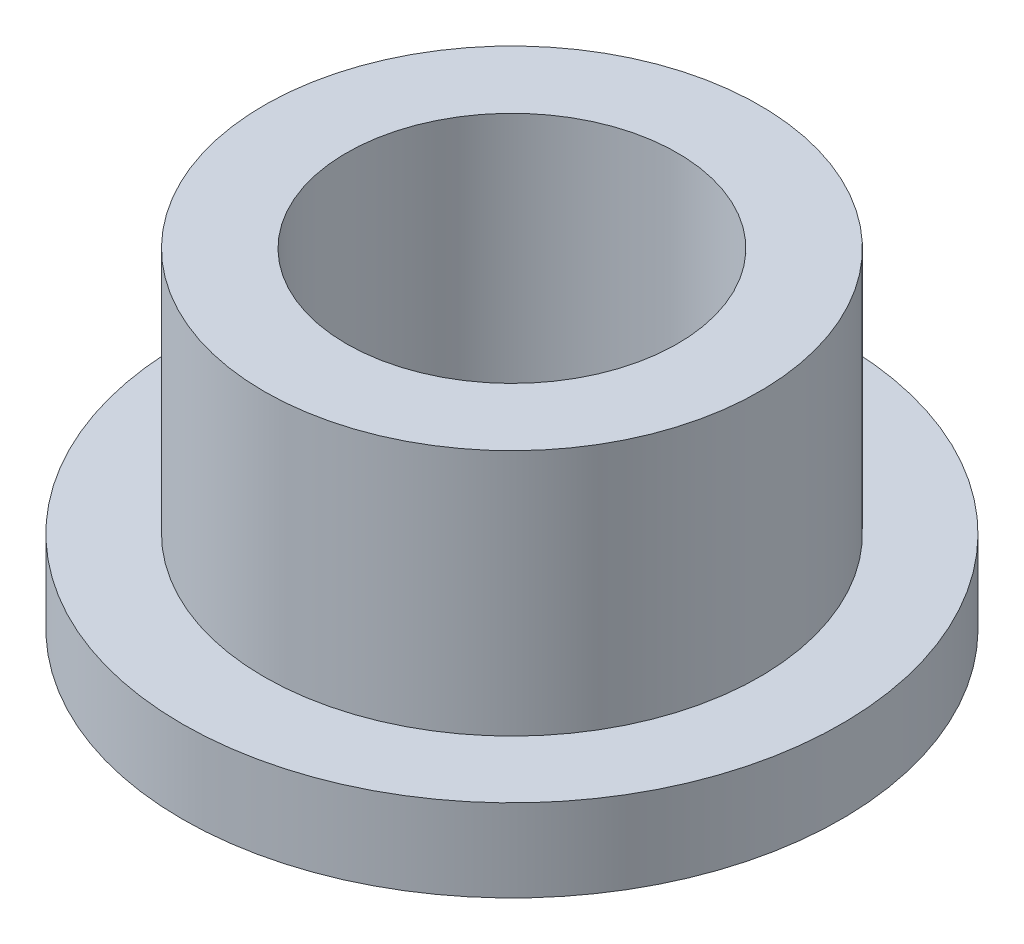
ISO-10303-21;
HEADER;
FILE_DESCRIPTION(('STEP AP214'),'2;1');
FILE_NAME('part.step','',(''),(''),'','','');
FILE_SCHEMA(('AUTOMOTIVE_DESIGN { 1 0 10303 214 1 1 1 1 }'));
ENDSEC;
DATA;
#1=APPLICATION_CONTEXT('core data for automotive mechanical design processes');
#2=APPLICATION_PROTOCOL_DEFINITION('international standard','automotive_design',2000,#1);
#3=PRODUCT_CONTEXT('',#1,'mechanical');
#4=PRODUCT('Part','Part','',(#3));
#5=PRODUCT_RELATED_PRODUCT_CATEGORY('part','',(#4));
#6=PRODUCT_DEFINITION_FORMATION('','',#4);
#7=PRODUCT_DEFINITION_CONTEXT('part definition',#1,'design');
#8=PRODUCT_DEFINITION('design','',#6,#7);
#9=PRODUCT_DEFINITION_SHAPE('','',#8);
#10=(LENGTH_UNIT() NAMED_UNIT(*) SI_UNIT(.MILLI.,.METRE.));
#11=(NAMED_UNIT(*) PLANE_ANGLE_UNIT() SI_UNIT($,.RADIAN.));
#12=(NAMED_UNIT(*) SI_UNIT($,.STERADIAN.) SOLID_ANGLE_UNIT());
#13=UNCERTAINTY_MEASURE_WITH_UNIT(LENGTH_MEASURE(1.E-05),#10,'distance_accuracy_value','');
#14=(GEOMETRIC_REPRESENTATION_CONTEXT(3) GLOBAL_UNCERTAINTY_ASSIGNED_CONTEXT((#13)) GLOBAL_UNIT_ASSIGNED_CONTEXT((#10,
#11,#12)) REPRESENTATION_CONTEXT('',''));
#15=CARTESIAN_POINT('',(0.,0.,0.));
#16=DIRECTION('',(0.,0.,1.));
#17=DIRECTION('',(1.,0.,0.));
#18=AXIS2_PLACEMENT_3D('',#15,#16,#17);
#19=CARTESIAN_POINT('',(0.,6.35,0.));
#20=DIRECTION('',(0.,1.,0.));
#21=DIRECTION('',(0.,0.,1.));
#22=AXIS2_PLACEMENT_3D('',#19,#20,#21);
#23=PLANE('',#22);
#24=CARTESIAN_POINT('',(0.,6.35,0.));
#25=DIRECTION('',(0.,1.,0.));
#26=DIRECTION('',(0.,0.,1.));
#27=AXIS2_PLACEMENT_3D('',#24,#25,#26);
#28=CIRCLE('',#27,4.7752);
#29=CARTESIAN_POINT('',(0.,6.35,4.7752));
#30=VERTEX_POINT('',#29);
#31=EDGE_CURVE('E10',#30,#30,#28,.T.);
#32=ORIENTED_EDGE('',*,*,#31,.T.);
#33=EDGE_LOOP('',(#32));
#34=FACE_BOUND('',#33,.T.);
#35=CARTESIAN_POINT('',(0.,6.35,0.));
#36=DIRECTION('',(0.,1.,0.));
#37=DIRECTION('',(0.,0.,1.));
#38=AXIS2_PLACEMENT_3D('',#35,#36,#37);
#39=CIRCLE('',#38,3.1877);
#40=CARTESIAN_POINT('',(0.,6.35,3.1877));
#41=VERTEX_POINT('',#40);
#42=EDGE_CURVE('E37',#41,#41,#39,.T.);
#43=ORIENTED_EDGE('',*,*,#42,.F.);
#44=EDGE_LOOP('',(#43));
#45=FACE_BOUND('',#44,.T.);
#46=ADVANCED_FACE('F30',(#34,#45),#23,.T.);
#47=CARTESIAN_POINT('',(0.,0.,0.));
#48=DIRECTION('',(0.,1.,0.));
#49=DIRECTION('',(0.,0.,1.));
#50=AXIS2_PLACEMENT_3D('',#47,#48,#49);
#51=PLANE('',#50);
#52=CARTESIAN_POINT('',(0.,0.,0.));
#53=DIRECTION('',(0.,1.,0.));
#54=DIRECTION('',(0.,0.,1.));
#55=AXIS2_PLACEMENT_3D('',#52,#53,#54);
#56=CIRCLE('',#55,3.1877);
#57=CARTESIAN_POINT('',(0.,0.,3.1877));
#58=VERTEX_POINT('',#57);
#59=EDGE_CURVE('E41',#58,#58,#56,.T.);
#60=ORIENTED_EDGE('',*,*,#59,.T.);
#61=EDGE_LOOP('',(#60));
#62=FACE_BOUND('',#61,.T.);
#63=CARTESIAN_POINT('',(0.,0.,0.));
#64=DIRECTION('',(0.,1.,0.));
#65=DIRECTION('',(0.,0.,1.));
#66=AXIS2_PLACEMENT_3D('',#63,#64,#65);
#67=CIRCLE('',#66,6.35);
#68=CARTESIAN_POINT('',(0.,0.,6.35));
#69=VERTEX_POINT('',#68);
#70=EDGE_CURVE('E48',#69,#69,#67,.T.);
#71=ORIENTED_EDGE('',*,*,#70,.F.);
#72=EDGE_LOOP('',(#71));
#73=FACE_BOUND('',#72,.T.);
#74=ADVANCED_FACE('F73',(#62,#73),#51,.F.);
#75=CARTESIAN_POINT('',(0.,6.35,0.));
#76=DIRECTION('',(0.,-1.,0.));
#77=DIRECTION('',(0.,0.,-1.));
#78=AXIS2_PLACEMENT_3D('',#75,#76,#77);
#79=CYLINDRICAL_SURFACE('',#78,4.7752);
#80=CARTESIAN_POINT('',(0.,1.5875,0.));
#81=DIRECTION('',(0.,1.,0.));
#82=DIRECTION('',(0.,0.,1.));
#83=AXIS2_PLACEMENT_3D('',#80,#81,#82);
#84=CIRCLE('',#83,4.7752);
#85=CARTESIAN_POINT('',(0.,1.5875,4.7752));
#86=VERTEX_POINT('',#85);
#87=EDGE_CURVE('E51',#86,#86,#84,.T.);
#88=ORIENTED_EDGE('',*,*,#87,.T.);
#89=EDGE_LOOP('',(#88));
#90=FACE_BOUND('',#89,.T.);
#91=ORIENTED_EDGE('',*,*,#31,.F.);
#92=EDGE_LOOP('',(#91));
#93=FACE_BOUND('',#92,.T.);
#94=ADVANCED_FACE('F32',(#90,#93),#79,.T.);
#95=CARTESIAN_POINT('',(0.,6.35,0.));
#96=DIRECTION('',(0.,-1.,0.));
#97=DIRECTION('',(0.,0.,-1.));
#98=AXIS2_PLACEMENT_3D('',#95,#96,#97);
#99=CYLINDRICAL_SURFACE('',#98,3.1877);
#100=ORIENTED_EDGE('',*,*,#42,.T.);
#101=EDGE_LOOP('',(#100));
#102=FACE_BOUND('',#101,.T.);
#103=ORIENTED_EDGE('',*,*,#59,.F.);
#104=EDGE_LOOP('',(#103));
#105=FACE_BOUND('',#104,.T.);
#106=ADVANCED_FACE('F62',(#102,#105),#99,.F.);
#107=CARTESIAN_POINT('',(0.,1.5875,0.));
#108=DIRECTION('',(0.,1.,0.));
#109=DIRECTION('',(0.,0.,1.));
#110=AXIS2_PLACEMENT_3D('',#107,#108,#109);
#111=PLANE('',#110);
#112=CARTESIAN_POINT('',(0.,1.5875,0.));
#113=DIRECTION('',(0.,1.,0.));
#114=DIRECTION('',(0.,0.,1.));
#115=AXIS2_PLACEMENT_3D('',#112,#113,#114);
#116=CIRCLE('',#115,6.35);
#117=CARTESIAN_POINT('',(0.,1.5875,6.35));
#118=VERTEX_POINT('',#117);
#119=EDGE_CURVE('E46',#118,#118,#116,.T.);
#120=ORIENTED_EDGE('',*,*,#119,.T.);
#121=EDGE_LOOP('',(#120));
#122=FACE_BOUND('',#121,.T.);
#123=ORIENTED_EDGE('',*,*,#87,.F.);
#124=EDGE_LOOP('',(#123));
#125=FACE_BOUND('',#124,.T.);
#126=ADVANCED_FACE('F59',(#122,#125),#111,.T.);
#127=CARTESIAN_POINT('',(0.,1.5875,0.));
#128=DIRECTION('',(0.,-1.,0.));
#129=DIRECTION('',(0.,0.,-1.));
#130=AXIS2_PLACEMENT_3D('',#127,#128,#129);
#131=CYLINDRICAL_SURFACE('',#130,6.35);
#132=ORIENTED_EDGE('',*,*,#119,.F.);
#133=EDGE_LOOP('',(#132));
#134=FACE_BOUND('',#133,.T.);
#135=ORIENTED_EDGE('',*,*,#70,.T.);
#136=EDGE_LOOP('',(#135));
#137=FACE_BOUND('',#136,.T.);
#138=ADVANCED_FACE('F61',(#134,#137),#131,.T.);
#139=CLOSED_SHELL('',(#46,#74,#94,#106,#126,#138));
#140=MANIFOLD_SOLID_BREP('B2',#139);
#141=ADVANCED_BREP_SHAPE_REPRESENTATION('',(#18,#140),#14);
#142=SHAPE_DEFINITION_REPRESENTATION(#9,#141);
ENDSEC;
END-ISO-10303-21;
